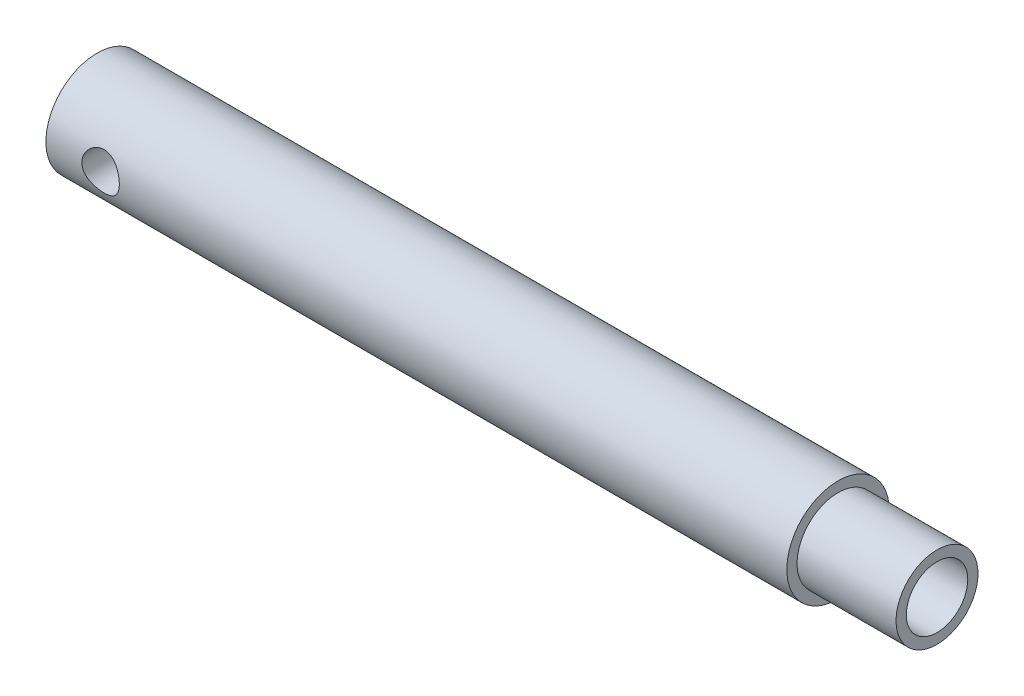
ISO-10303-21;
HEADER;
FILE_DESCRIPTION(('STEP AP214'),'2;1');
FILE_NAME('part.step','',(''),(''),'','','');
FILE_SCHEMA(('AUTOMOTIVE_DESIGN { 1 0 10303 214 1 1 1 1 }'));
ENDSEC;
DATA;
#1=APPLICATION_CONTEXT('core data for automotive mechanical design processes');
#2=APPLICATION_PROTOCOL_DEFINITION('international standard','automotive_design',2000,#1);
#3=PRODUCT_CONTEXT('',#1,'mechanical');
#4=PRODUCT('Part','Part','',(#3));
#5=PRODUCT_RELATED_PRODUCT_CATEGORY('part','',(#4));
#6=PRODUCT_DEFINITION_FORMATION('','',#4);
#7=PRODUCT_DEFINITION_CONTEXT('part definition',#1,'design');
#8=PRODUCT_DEFINITION('design','',#6,#7);
#9=PRODUCT_DEFINITION_SHAPE('','',#8);
#10=(LENGTH_UNIT() NAMED_UNIT(*) SI_UNIT(.MILLI.,.METRE.));
#11=(NAMED_UNIT(*) PLANE_ANGLE_UNIT() SI_UNIT($,.RADIAN.));
#12=(NAMED_UNIT(*) SI_UNIT($,.STERADIAN.) SOLID_ANGLE_UNIT());
#13=UNCERTAINTY_MEASURE_WITH_UNIT(LENGTH_MEASURE(1.E-05),#10,'distance_accuracy_value','');
#14=(GEOMETRIC_REPRESENTATION_CONTEXT(3) GLOBAL_UNCERTAINTY_ASSIGNED_CONTEXT((#13)) GLOBAL_UNIT_ASSIGNED_CONTEXT((#10,
#11,#12)) REPRESENTATION_CONTEXT('',''));
#15=CARTESIAN_POINT('',(0.,0.,0.));
#16=DIRECTION('',(0.,0.,1.));
#17=DIRECTION('',(1.,0.,0.));
#18=AXIS2_PLACEMENT_3D('',#15,#16,#17);
#19=CARTESIAN_POINT('',(123.,0.,0.));
#20=DIRECTION('',(1.,0.,0.));
#21=DIRECTION('',(0.,0.,-1.));
#22=AXIS2_PLACEMENT_3D('',#19,#20,#21);
#23=CYLINDRICAL_SURFACE('',#22,7.5);
#24=CARTESIAN_POINT('',(10.75,0.,7.5));
#25=CARTESIAN_POINT('',(10.7500042398441,0.149163400914619,7.50000312186943));
#26=CARTESIAN_POINT('',(10.7378254857149,0.29829715261848,7.49551083407196));
#27=CARTESIAN_POINT('',(10.6896192360573,0.592120610638628,7.47803771691331));
#28=CARTESIAN_POINT('',(10.6535940020788,0.736810737017477,7.46505769251259));
#29=CARTESIAN_POINT('',(10.5591314540441,1.01746784637522,7.43200599882739));
#30=CARTESIAN_POINT('',(10.5007361961014,1.15345064275875,7.41194764249896));
#31=CARTESIAN_POINT('',(10.3634001973795,1.41368339201445,7.36674725461798));
#32=CARTESIAN_POINT('',(10.2844542125463,1.53793033913379,7.34160392586796));
#33=CARTESIAN_POINT('',(10.1048834128569,1.7762429222357,7.28769120419502));
#34=CARTESIAN_POINT('',(10.0035669930007,1.88976472910907,7.25882233991119));
#35=CARTESIAN_POINT('',(9.78359974595652,2.09863947514447,7.20121334184221));
#36=CARTESIAN_POINT('',(9.66494396335599,2.19398720232952,7.17247324728629));
#37=CARTESIAN_POINT('',(9.40844037144512,2.36719005872891,7.11723192199314));
#38=CARTESIAN_POINT('',(9.27005454324459,2.44428985961203,7.09084889561059));
#39=CARTESIAN_POINT('',(8.9811593733666,2.5738807153727,7.04484932142569));
#40=CARTESIAN_POINT('',(8.83065465758281,2.626381108384,7.02523020673632));
#41=CARTESIAN_POINT('',(8.5280411185994,2.70315787768425,6.99603990329749));
#42=CARTESIAN_POINT('',(8.3762312559657,2.72846856766621,6.98610194555094));
#43=CARTESIAN_POINT('',(8.07021881070405,2.75338169967862,6.97632326042149));
#44=CARTESIAN_POINT('',(7.91601718476962,2.7529941686023,6.97647859485257));
#45=CARTESIAN_POINT('',(7.61892107740938,2.72731524634157,6.98655161563675));
#46=CARTESIAN_POINT('',(7.4758819285807,2.70343999386611,6.99591416236742));
#47=CARTESIAN_POINT('',(7.1960026954969,2.63379801380004,7.02242705549906));
#48=CARTESIAN_POINT('',(7.05916350641865,2.58802813592603,7.03957852258203));
#49=CARTESIAN_POINT('',(6.79261420844082,2.47508832183277,7.08008337610026));
#50=CARTESIAN_POINT('',(6.66308140599621,2.40754043957436,7.10354498086313));
#51=CARTESIAN_POINT('',(6.41677064932366,2.25322516181072,7.15398860670264));
#52=CARTESIAN_POINT('',(6.29999697892969,2.16645134069005,7.18097180350953));
#53=CARTESIAN_POINT('',(6.07465451629212,1.96960155284458,7.23752687525343));
#54=CARTESIAN_POINT('',(5.967089800233,1.85838932735392,7.26715387777086));
#55=CARTESIAN_POINT('',(5.77184624585726,1.61915779399269,7.32416772152515));
#56=CARTESIAN_POINT('',(5.68417020098944,1.49113612914646,7.3515542477326));
#57=CARTESIAN_POINT('',(5.53015007880803,1.21944943250202,7.40150404263883));
#58=CARTESIAN_POINT('',(5.46412666462135,1.07558804380358,7.42399328235867));
#59=CARTESIAN_POINT('',(5.35754756842616,0.777771681936057,7.46106828194135));
#60=CARTESIAN_POINT('',(5.31698109264479,0.623821017253827,7.47565739110895));
#61=CARTESIAN_POINT('',(5.26436589929931,0.318657156904127,7.49470661210037));
#62=CARTESIAN_POINT('',(5.25096416812749,0.167706972782519,7.49964681722227));
#63=CARTESIAN_POINT('',(5.24913699812723,-0.134347967443712,7.50031608885126));
#64=CARTESIAN_POINT('',(5.26070630836306,-0.285452684374519,7.49604709187873));
#65=CARTESIAN_POINT('',(5.30745479202294,-0.577771015399043,7.47909471176213));
#66=CARTESIAN_POINT('',(5.34175932799965,-0.719144462031496,7.46672323625137));
#67=CARTESIAN_POINT('',(5.43186505273531,-0.994039091678319,7.43512235809386));
#68=CARTESIAN_POINT('',(5.4876690384557,-1.12755925041647,7.41589206317618));
#69=CARTESIAN_POINT('',(5.62094608837148,-1.38727106994184,7.3717934654489));
#70=CARTESIAN_POINT('',(5.69899813004904,-1.51313995048619,7.34677844528394));
#71=CARTESIAN_POINT('',(5.87389639178215,-1.75040675458894,7.29389308718916));
#72=CARTESIAN_POINT('',(5.97074932685248,-1.86179948397539,7.26602173076095));
#73=CARTESIAN_POINT('',(6.18682262576501,-2.07340222713799,7.20858443222809));
#74=CARTESIAN_POINT('',(6.30698505976254,-2.17265048905074,7.17901017230758));
#75=CARTESIAN_POINT('',(6.56285499492149,-2.34974917445373,7.12301420495134));
#76=CARTESIAN_POINT('',(6.69856357482792,-2.4275981117719,7.09659271654603));
#77=CARTESIAN_POINT('',(6.98253737153424,-2.55965637109161,7.05004267507774));
#78=CARTESIAN_POINT('',(7.13083460114393,-2.61380312956744,7.02993081583834));
#79=CARTESIAN_POINT('',(7.43537884810097,-2.69602324831299,6.99881623412452));
#80=CARTESIAN_POINT('',(7.59162118348533,-2.72411178082589,6.98780821140261));
#81=CARTESIAN_POINT('',(7.8972513600388,-2.75209516962454,6.97683139543634));
#82=CARTESIAN_POINT('',(8.04646829196544,-2.75362072167425,6.97622414135253));
#83=CARTESIAN_POINT('',(8.34291155021715,-2.73257863119115,6.98449276936025));
#84=CARTESIAN_POINT('',(8.49013804755031,-2.710013071938,6.99336783146823));
#85=CARTESIAN_POINT('',(8.77426908596597,-2.64267697104267,7.01908063198066));
#86=CARTESIAN_POINT('',(8.9113469700752,-2.59854310235921,7.03568945153917));
#87=CARTESIAN_POINT('',(9.1762391529618,-2.48987356543402,7.0748745278557));
#88=CARTESIAN_POINT('',(9.30405115114603,-2.42533285163216,7.09745226019147));
#89=CARTESIAN_POINT('',(9.553826483125,-2.27387853742159,7.14745651289183));
#90=CARTESIAN_POINT('',(9.67516442831964,-2.18599626211841,7.17507087475862));
#91=CARTESIAN_POINT('',(9.90189324448292,-1.99188099952364,7.23136315938062));
#92=CARTESIAN_POINT('',(10.0072791430997,-1.88564231243218,7.26004141030265));
#93=CARTESIAN_POINT('',(10.2045599797036,-1.65137159946744,7.31698041886032));
#94=CARTESIAN_POINT('',(10.2954974036853,-1.52250654028015,7.34514593066589));
#95=CARTESIAN_POINT('',(10.4543773454967,-1.25034215145006,7.39633669940812));
#96=CARTESIAN_POINT('',(10.5223197694751,-1.10704276289835,7.41936193536523));
#97=CARTESIAN_POINT('',(10.6341699766262,-0.806234015924115,7.45811714803401));
#98=CARTESIAN_POINT('',(10.6774402256295,-0.648460466045057,7.4736521370045));
#99=CARTESIAN_POINT('',(10.7353465218756,-0.32711098218088,7.49458959004745));
#100=CARTESIAN_POINT('',(10.7499953515793,-0.163537671643998,7.4999965772887));
#101=CARTESIAN_POINT('',(10.75,0.,7.5));
#102=B_SPLINE_CURVE_WITH_KNOTS('',3,(#24,#25,#26,#27,#28,#29,#30,#31,#32,#33,#34,#35,#36,#37,
#38,#39,#40,#41,#42,#43,#44,#45,#46,#47,#48,#49,#50,#51,#52,#53,#54,#55,#56,#57,#58,#59,#60,#61,
#62,#63,#64,#65,#66,#67,#68,#69,#70,#71,#72,#73,#74,#75,#76,#77,#78,#79,#80,#81,#82,#83,#84,#85,
#86,#87,#88,#89,#90,#91,#92,#93,#94,#95,#96,#97,#98,#99,#100,#101),.UNSPECIFIED.,.T.,.F.,(4,2,2,
2,2,2,2,2,2,2,2,2,2,2,2,2,2,2,2,2,2,2,2,2,2,2,2,2,2,2,2,2,2,2,2,2,2,2,4),(0.,0.446887269349348,
0.89373216292337,1.33974106914939,1.7858638979375,2.24842473965862,2.71111803601497,
3.19050672893151,3.66971329430219,4.12996375453753,4.5900346359978,5.0239670519462,
5.45796192255757,5.89993527296308,6.34205656133036,6.81248619551746,7.28298186270095,
7.76015995462979,8.23713558552159,8.68970480563612,9.14217886831115,9.57818454876607,
10.0142469703521,10.4628962097749,10.9117059866708,11.385386450699,11.8590998032843,
12.3340561236824,12.80873572978,13.254164536792,13.6995548284527,14.13252653843,
14.5656053837986,15.020648736522,15.4758336382825,15.9541458857871,16.4324600854427,
16.9226310274791,17.4125830067758),.UNSPECIFIED.);
#103=CARTESIAN_POINT('',(10.75,0.,7.5));
#104=VERTEX_POINT('',#103);
#105=EDGE_CURVE('E136',#104,#104,#102,.T.);
#106=ORIENTED_EDGE('',*,*,#105,.F.);
#107=EDGE_LOOP('',(#106));
#108=FACE_BOUND('',#107,.T.);
#109=CARTESIAN_POINT('',(5.25,0.,-7.5));
#110=CARTESIAN_POINT('',(5.24999576015586,0.149163400914619,-7.50000312186943));
#111=CARTESIAN_POINT('',(5.26217451428514,0.29829715261848,-7.49551083407196));
#112=CARTESIAN_POINT('',(5.31038076394274,0.592120610638627,-7.47803771691331));
#113=CARTESIAN_POINT('',(5.34640599792119,0.736810737017476,-7.46505769251259));
#114=CARTESIAN_POINT('',(5.44086854595593,1.01746784637522,-7.43200599882739));
#115=CARTESIAN_POINT('',(5.4992638038986,1.15345064275874,-7.41194764249896));
#116=CARTESIAN_POINT('',(5.63659980262049,1.41368339201445,-7.36674725461798));
#117=CARTESIAN_POINT('',(5.71554578745375,1.53793033913379,-7.34160392586796));
#118=CARTESIAN_POINT('',(5.89511658714314,1.7762429222357,-7.28769120419502));
#119=CARTESIAN_POINT('',(5.99643300699934,1.88976472910907,-7.25882233991119));
#120=CARTESIAN_POINT('',(6.21640025404348,2.09863947514447,-7.20121334184221));
#121=CARTESIAN_POINT('',(6.33505603664401,2.19398720232952,-7.17247324728629));
#122=CARTESIAN_POINT('',(6.59155962855488,2.36719005872891,-7.11723192199314));
#123=CARTESIAN_POINT('',(6.72994545675541,2.44428985961203,-7.09084889561059));
#124=CARTESIAN_POINT('',(7.0188406266334,2.5738807153727,-7.04484932142569));
#125=CARTESIAN_POINT('',(7.16934534241719,2.626381108384,-7.02523020673632));
#126=CARTESIAN_POINT('',(7.4719588814006,2.70315787768425,-6.99603990329749));
#127=CARTESIAN_POINT('',(7.6237687440343,2.72846856766621,-6.98610194555094));
#128=CARTESIAN_POINT('',(7.92978118929595,2.75338169967862,-6.97632326042149));
#129=CARTESIAN_POINT('',(8.08398281523038,2.7529941686023,-6.97647859485257));
#130=CARTESIAN_POINT('',(8.38107892259062,2.72731524634157,-6.98655161563675));
#131=CARTESIAN_POINT('',(8.5241180714193,2.70343999386611,-6.99591416236742));
#132=CARTESIAN_POINT('',(8.8039973045031,2.63379801380004,-7.02242705549906));
#133=CARTESIAN_POINT('',(8.94083649358135,2.58802813592603,-7.03957852258203));
#134=CARTESIAN_POINT('',(9.20738579155918,2.47508832183277,-7.08008337610026));
#135=CARTESIAN_POINT('',(9.33691859400379,2.40754043957436,-7.10354498086313));
#136=CARTESIAN_POINT('',(9.58322935067634,2.25322516181072,-7.15398860670264));
#137=CARTESIAN_POINT('',(9.70000302107031,2.16645134069005,-7.18097180350954));
#138=CARTESIAN_POINT('',(9.92534548370788,1.96960155284458,-7.23752687525343));
#139=CARTESIAN_POINT('',(10.032910199767,1.85838932735392,-7.26715387777086));
#140=CARTESIAN_POINT('',(10.2281537541427,1.61915779399269,-7.32416772152515));
#141=CARTESIAN_POINT('',(10.3158297990106,1.49113612914646,-7.3515542477326));
#142=CARTESIAN_POINT('',(10.469849921192,1.21944943250202,-7.40150404263883));
#143=CARTESIAN_POINT('',(10.5358733353786,1.07558804380358,-7.42399328235867));
#144=CARTESIAN_POINT('',(10.6424524315738,0.777771681936057,-7.46106828194135));
#145=CARTESIAN_POINT('',(10.6830189073552,0.623821017253826,-7.47565739110895));
#146=CARTESIAN_POINT('',(10.7356341007007,0.318657156904126,-7.49470661210037));
#147=CARTESIAN_POINT('',(10.7490358318725,0.167706972782518,-7.49964681722227));
#148=CARTESIAN_POINT('',(10.7508630018728,-0.134347967443713,-7.50031608885126));
#149=CARTESIAN_POINT('',(10.7392936916369,-0.28545268437452,-7.49604709187873));
#150=CARTESIAN_POINT('',(10.6925452079771,-0.577771015399044,-7.47909471176213));
#151=CARTESIAN_POINT('',(10.6582406720003,-0.719144462031497,-7.46672323625137));
#152=CARTESIAN_POINT('',(10.5681349472647,-0.99403909167832,-7.43512235809386));
#153=CARTESIAN_POINT('',(10.5123309615443,-1.12755925041647,-7.41589206317618));
#154=CARTESIAN_POINT('',(10.3790539116285,-1.38727106994184,-7.3717934654489));
#155=CARTESIAN_POINT('',(10.301001869951,-1.51313995048619,-7.34677844528394));
#156=CARTESIAN_POINT('',(10.1261036082178,-1.75040675458894,-7.29389308718916));
#157=CARTESIAN_POINT('',(10.0292506731475,-1.86179948397539,-7.26602173076095));
#158=CARTESIAN_POINT('',(9.81317737423499,-2.07340222713799,-7.20858443222809));
#159=CARTESIAN_POINT('',(9.69301494023746,-2.17265048905074,-7.17901017230759));
#160=CARTESIAN_POINT('',(9.43714500507851,-2.34974917445373,-7.12301420495134));
#161=CARTESIAN_POINT('',(9.30143642517208,-2.4275981117719,-7.09659271654603));
#162=CARTESIAN_POINT('',(9.01746262846576,-2.55965637109161,-7.05004267507774));
#163=CARTESIAN_POINT('',(8.86916539885607,-2.61380312956744,-7.02993081583834));
#164=CARTESIAN_POINT('',(8.56462115189903,-2.69602324831299,-6.99881623412452));
#165=CARTESIAN_POINT('',(8.40837881651467,-2.72411178082589,-6.98780821140261));
#166=CARTESIAN_POINT('',(8.1027486399612,-2.75209516962454,-6.97683139543633));
#167=CARTESIAN_POINT('',(7.95353170803456,-2.75362072167425,-6.97622414135252));
#168=CARTESIAN_POINT('',(7.65708844978285,-2.73257863119115,-6.98449276936025));
#169=CARTESIAN_POINT('',(7.50986195244969,-2.710013071938,-6.99336783146823));
#170=CARTESIAN_POINT('',(7.22573091403403,-2.64267697104267,-7.01908063198066));
#171=CARTESIAN_POINT('',(7.0886530299248,-2.59854310235921,-7.03568945153917));
#172=CARTESIAN_POINT('',(6.8237608470382,-2.48987356543402,-7.0748745278557));
#173=CARTESIAN_POINT('',(6.69594884885397,-2.42533285163216,-7.09745226019147));
#174=CARTESIAN_POINT('',(6.446173516875,-2.27387853742159,-7.14745651289183));
#175=CARTESIAN_POINT('',(6.32483557168036,-2.18599626211841,-7.17507087475862));
#176=CARTESIAN_POINT('',(6.09810675551708,-1.99188099952364,-7.23136315938062));
#177=CARTESIAN_POINT('',(5.9927208569003,-1.88564231243218,-7.26004141030265));
#178=CARTESIAN_POINT('',(5.79544002029642,-1.65137159946743,-7.31698041886032));
#179=CARTESIAN_POINT('',(5.70450259631471,-1.52250654028015,-7.34514593066589));
#180=CARTESIAN_POINT('',(5.5456226545033,-1.25034215145006,-7.39633669940812));
#181=CARTESIAN_POINT('',(5.47768023052494,-1.10704276289835,-7.41936193536523));
#182=CARTESIAN_POINT('',(5.3658300233738,-0.806234015924114,-7.45811714803401));
#183=CARTESIAN_POINT('',(5.32255977437051,-0.648460466045057,-7.4736521370045));
#184=CARTESIAN_POINT('',(5.26465347812442,-0.32711098218088,-7.49458959004745));
#185=CARTESIAN_POINT('',(5.2500046484207,-0.163537671643997,-7.4999965772887));
#186=CARTESIAN_POINT('',(5.25,0.,-7.5));
#187=B_SPLINE_CURVE_WITH_KNOTS('',3,(#109,#110,#111,#112,#113,#114,#115,#116,#117,#118,#119,
#120,#121,#122,#123,#124,#125,#126,#127,#128,#129,#130,#131,#132,#133,#134,#135,#136,#137,#138,
#139,#140,#141,#142,#143,#144,#145,#146,#147,#148,#149,#150,#151,#152,#153,#154,#155,#156,#157,
#158,#159,#160,#161,#162,#163,#164,#165,#166,#167,#168,#169,#170,#171,#172,#173,#174,#175,#176,
#177,#178,#179,#180,#181,#182,#183,#184,#185,#186),.UNSPECIFIED.,.T.,.F.,(4,2,2,2,2,2,2,2,2,2,2,
2,2,2,2,2,2,2,2,2,2,2,2,2,2,2,2,2,2,2,2,2,2,2,2,2,2,2,4),(0.,0.446887269349348,
0.893732162923369,1.33974106914939,1.7858638979375,2.24842473965861,2.71111803601497,
3.1905067289315,3.66971329430219,4.12996375453753,4.5900346359978,5.0239670519462,
5.45796192255757,5.89993527296308,6.34205656133036,6.81248619551746,7.28298186270094,
7.76015995462979,8.23713558552158,8.68970480563611,9.14217886831115,9.57818454876606,
10.0142469703521,10.4628962097749,10.9117059866708,11.385386450699,11.8590998032843,
12.3340561236824,12.80873572978,13.254164536792,13.6995548284527,14.13252653843,
14.5656053837986,15.020648736522,15.4758336382825,15.9541458857871,16.4324600854427,
16.9226310274791,17.4125830067758),.UNSPECIFIED.);
#188=CARTESIAN_POINT('',(5.25,0.,-7.5));
#189=VERTEX_POINT('',#188);
#190=EDGE_CURVE('E70',#189,#189,#187,.T.);
#191=ORIENTED_EDGE('',*,*,#190,.F.);
#192=EDGE_LOOP('',(#191));
#193=FACE_BOUND('',#192,.T.);
#194=CARTESIAN_POINT('',(0.,0.,0.));
#195=DIRECTION('',(1.,0.,0.));
#196=DIRECTION('',(0.,0.,-1.));
#197=AXIS2_PLACEMENT_3D('',#194,#195,#196);
#198=CIRCLE('',#197,7.5);
#199=CARTESIAN_POINT('',(0.,0.,-7.5));
#200=VERTEX_POINT('',#199);
#201=EDGE_CURVE('E67',#200,#200,#198,.T.);
#202=ORIENTED_EDGE('',*,*,#201,.T.);
#203=EDGE_LOOP('',(#202));
#204=FACE_BOUND('',#203,.T.);
#205=CARTESIAN_POINT('',(108.5,0.,0.));
#206=DIRECTION('',(1.,0.,0.));
#207=DIRECTION('',(0.,0.,-1.));
#208=AXIS2_PLACEMENT_3D('',#205,#206,#207);
#209=CIRCLE('',#208,7.5);
#210=CARTESIAN_POINT('',(108.5,0.,-7.5));
#211=VERTEX_POINT('',#210);
#212=EDGE_CURVE('E10',#211,#211,#209,.T.);
#213=ORIENTED_EDGE('',*,*,#212,.F.);
#214=EDGE_LOOP('',(#213));
#215=FACE_BOUND('',#214,.T.);
#216=ADVANCED_FACE('F32',(#108,#193,#204,#215),#23,.T.);
#217=CARTESIAN_POINT('',(108.5,7.5,0.));
#218=DIRECTION('',(1.,0.,0.));
#219=DIRECTION('',(0.,0.,-1.));
#220=AXIS2_PLACEMENT_3D('',#217,#218,#219);
#221=PLANE('',#220);
#222=ORIENTED_EDGE('',*,*,#212,.T.);
#223=EDGE_LOOP('',(#222));
#224=FACE_BOUND('',#223,.T.);
#225=CARTESIAN_POINT('',(108.5,0.,0.));
#226=DIRECTION('',(1.,0.,0.));
#227=DIRECTION('',(0.,0.,-1.));
#228=AXIS2_PLACEMENT_3D('',#225,#226,#227);
#229=CIRCLE('',#228,6.);
#230=CARTESIAN_POINT('',(108.5,0.,-6.));
#231=VERTEX_POINT('',#230);
#232=EDGE_CURVE('E39',#231,#231,#229,.T.);
#233=ORIENTED_EDGE('',*,*,#232,.F.);
#234=EDGE_LOOP('',(#233));
#235=FACE_BOUND('',#234,.T.);
#236=ADVANCED_FACE('F124',(#224,#235),#221,.T.);
#237=CARTESIAN_POINT('',(123.,0.,0.));
#238=DIRECTION('',(1.,0.,0.));
#239=DIRECTION('',(0.,0.,-1.));
#240=AXIS2_PLACEMENT_3D('',#237,#238,#239);
#241=CYLINDRICAL_SURFACE('',#240,6.);
#242=ORIENTED_EDGE('',*,*,#232,.T.);
#243=EDGE_LOOP('',(#242));
#244=FACE_BOUND('',#243,.T.);
#245=CARTESIAN_POINT('',(123.,0.,0.));
#246=DIRECTION('',(1.,0.,0.));
#247=DIRECTION('',(0.,0.,-1.));
#248=AXIS2_PLACEMENT_3D('',#245,#246,#247);
#249=CIRCLE('',#248,6.);
#250=CARTESIAN_POINT('',(123.,0.,-6.));
#251=VERTEX_POINT('',#250);
#252=EDGE_CURVE('E43',#251,#251,#249,.T.);
#253=ORIENTED_EDGE('',*,*,#252,.F.);
#254=EDGE_LOOP('',(#253));
#255=FACE_BOUND('',#254,.T.);
#256=ADVANCED_FACE('F121',(#244,#255),#241,.T.);
#257=CARTESIAN_POINT('',(123.,6.,0.));
#258=DIRECTION('',(1.,0.,0.));
#259=DIRECTION('',(0.,0.,-1.));
#260=AXIS2_PLACEMENT_3D('',#257,#258,#259);
#261=PLANE('',#260);
#262=ORIENTED_EDGE('',*,*,#252,.T.);
#263=EDGE_LOOP('',(#262));
#264=FACE_BOUND('',#263,.T.);
#265=CARTESIAN_POINT('',(123.,0.,0.));
#266=DIRECTION('',(1.,0.,0.));
#267=DIRECTION('',(0.,0.,-1.));
#268=AXIS2_PLACEMENT_3D('',#265,#266,#267);
#269=CIRCLE('',#268,4.5);
#270=CARTESIAN_POINT('',(123.,0.,-4.5));
#271=VERTEX_POINT('',#270);
#272=EDGE_CURVE('E47',#271,#271,#269,.T.);
#273=ORIENTED_EDGE('',*,*,#272,.F.);
#274=EDGE_LOOP('',(#273));
#275=FACE_BOUND('',#274,.T.);
#276=ADVANCED_FACE('F117',(#264,#275),#261,.T.);
#277=CARTESIAN_POINT('',(123.,0.,0.));
#278=DIRECTION('',(1.,0.,0.));
#279=DIRECTION('',(0.,0.,-1.));
#280=AXIS2_PLACEMENT_3D('',#277,#278,#279);
#281=CYLINDRICAL_SURFACE('',#280,4.5);
#282=ORIENTED_EDGE('',*,*,#272,.T.);
#283=EDGE_LOOP('',(#282));
#284=FACE_BOUND('',#283,.T.);
#285=CARTESIAN_POINT('',(100.,0.,0.));
#286=DIRECTION('',(1.,0.,0.));
#287=DIRECTION('',(0.,0.,-1.));
#288=AXIS2_PLACEMENT_3D('',#285,#286,#287);
#289=CIRCLE('',#288,4.5);
#290=CARTESIAN_POINT('',(100.,0.,-4.5));
#291=VERTEX_POINT('',#290);
#292=EDGE_CURVE('E52',#291,#291,#289,.T.);
#293=ORIENTED_EDGE('',*,*,#292,.F.);
#294=EDGE_LOOP('',(#293));
#295=FACE_BOUND('',#294,.T.);
#296=ADVANCED_FACE('F113',(#284,#295),#281,.F.);
#297=CARTESIAN_POINT('',(100.,4.,0.));
#298=DIRECTION('',(1.,0.,0.));
#299=DIRECTION('',(0.,0.,-1.));
#300=AXIS2_PLACEMENT_3D('',#297,#298,#299);
#301=PLANE('',#300);
#302=ORIENTED_EDGE('',*,*,#292,.T.);
#303=EDGE_LOOP('',(#302));
#304=FACE_BOUND('',#303,.T.);
#305=CARTESIAN_POINT('',(100.,0.,0.));
#306=DIRECTION('',(1.,0.,0.));
#307=DIRECTION('',(0.,0.,-1.));
#308=AXIS2_PLACEMENT_3D('',#305,#306,#307);
#309=CIRCLE('',#308,4.);
#310=CARTESIAN_POINT('',(100.,0.,-4.));
#311=VERTEX_POINT('',#310);
#312=EDGE_CURVE('E55',#311,#311,#309,.T.);
#313=ORIENTED_EDGE('',*,*,#312,.F.);
#314=EDGE_LOOP('',(#313));
#315=FACE_BOUND('',#314,.T.);
#316=ADVANCED_FACE('F109',(#304,#315),#301,.T.);
#317=CARTESIAN_POINT('',(123.,0.,0.));
#318=DIRECTION('',(1.,0.,0.));
#319=DIRECTION('',(0.,0.,-1.));
#320=AXIS2_PLACEMENT_3D('',#317,#318,#319);
#321=CYLINDRICAL_SURFACE('',#320,3.99999999999999);
#322=ORIENTED_EDGE('',*,*,#312,.T.);
#323=EDGE_LOOP('',(#322));
#324=FACE_BOUND('',#323,.T.);
#325=CARTESIAN_POINT('',(11.,0.,0.));
#326=DIRECTION('',(1.,0.,0.));
#327=DIRECTION('',(0.,0.,-1.));
#328=AXIS2_PLACEMENT_3D('',#325,#326,#327);
#329=CIRCLE('',#328,3.99999999999999);
#330=CARTESIAN_POINT('',(11.,0.,-3.99999999999999));
#331=VERTEX_POINT('',#330);
#332=EDGE_CURVE('E58',#331,#331,#329,.T.);
#333=ORIENTED_EDGE('',*,*,#332,.F.);
#334=EDGE_LOOP('',(#333));
#335=FACE_BOUND('',#334,.T.);
#336=ADVANCED_FACE('F105',(#324,#335),#321,.F.);
#337=CARTESIAN_POINT('',(11.,3.99999999999999,0.));
#338=DIRECTION('',(1.,0.,0.));
#339=DIRECTION('',(0.,0.,-1.));
#340=AXIS2_PLACEMENT_3D('',#337,#338,#339);
#341=PLANE('',#340);
#342=ORIENTED_EDGE('',*,*,#332,.T.);
#343=EDGE_LOOP('',(#342));
#344=FACE_BOUND('',#343,.T.);
#345=CARTESIAN_POINT('',(11.,0.,0.));
#346=DIRECTION('',(1.,0.,0.));
#347=DIRECTION('',(0.,0.,-1.));
#348=AXIS2_PLACEMENT_3D('',#345,#346,#347);
#349=CIRCLE('',#348,3.5);
#350=CARTESIAN_POINT('',(11.,0.,-3.5));
#351=VERTEX_POINT('',#350);
#352=EDGE_CURVE('E61',#351,#351,#349,.T.);
#353=ORIENTED_EDGE('',*,*,#352,.F.);
#354=EDGE_LOOP('',(#353));
#355=FACE_BOUND('',#354,.T.);
#356=ADVANCED_FACE('F101',(#344,#355),#341,.T.);
#357=CARTESIAN_POINT('',(123.,0.,0.));
#358=DIRECTION('',(1.,0.,0.));
#359=DIRECTION('',(0.,0.,-1.));
#360=AXIS2_PLACEMENT_3D('',#357,#358,#359);
#361=CYLINDRICAL_SURFACE('',#360,3.5);
#362=CARTESIAN_POINT('',(10.75,0.,3.5));
#363=CARTESIAN_POINT('',(10.7499995355662,-0.0663689307559184,3.49999955674576));
#364=CARTESIAN_POINT('',(10.7475914860623,-0.132745851858584,3.49810639539016));
#365=CARTESIAN_POINT('',(10.7380111247323,-0.264952535682278,3.49058704511513));
#366=CARTESIAN_POINT('',(10.7308364457554,-0.330782010081833,3.48495900142128));
#367=CARTESIAN_POINT('',(10.7022858605157,-0.526828755623839,3.46261392789626));
#368=CARTESIAN_POINT('',(10.6738836584641,-0.655497673920044,3.44043623430095));
#369=CARTESIAN_POINT('',(10.6003965560697,-0.903979204255256,3.38364111689331));
#370=CARTESIAN_POINT('',(10.5554158614788,-1.02384164344569,3.34910143400016));
#371=CARTESIAN_POINT('',(10.4509724612366,-1.25345411311455,3.27010728298878));
#372=CARTESIAN_POINT('',(10.3915092483714,-1.36320378923318,3.22565246762246));
#373=CARTESIAN_POINT('',(10.2378476409064,-1.60678109688964,3.11317241900944));
#374=CARTESIAN_POINT('',(10.1387082275262,-1.73615288293255,3.04226635425376));
#375=CARTESIAN_POINT('',(9.92150362845824,-1.97392531209018,2.89366827121686));
#376=CARTESIAN_POINT('',(9.80338447736297,-2.08226415215584,2.81595719971648));
#377=CARTESIAN_POINT('',(9.61263214133305,-2.22900537779148,2.69917398223201));
#378=CARTESIAN_POINT('',(9.54623944315643,-2.27557746649745,2.65991707813009));
#379=CARTESIAN_POINT('',(9.4090578300489,-2.36298028675325,2.58258060610051));
#380=CARTESIAN_POINT('',(9.33826759893434,-2.40380928734208,2.54450139581487));
#381=CARTESIAN_POINT('',(9.19249623805877,-2.47934895939843,2.47095128139155));
#382=CARTESIAN_POINT('',(9.11752768826433,-2.51407681447756,2.43547322119007));
#383=CARTESIAN_POINT('',(8.96323986268085,-2.57713192252029,2.36864934193178));
#384=CARTESIAN_POINT('',(8.8839243034485,-2.60546454030521,2.3373000685938));
#385=CARTESIAN_POINT('',(8.70676734558343,-2.65950617243312,2.27573876931547));
#386=CARTESIAN_POINT('',(8.60810404019919,-2.68390056317434,2.24667406216111));
#387=CARTESIAN_POINT('',(8.40608611217337,-2.72178334536306,2.20063763936689));
#388=CARTESIAN_POINT('',(8.30274326535531,-2.73529766280693,2.18363718749645));
#389=CARTESIAN_POINT('',(8.09294506557598,-2.75045032098895,2.16453132459079));
#390=CARTESIAN_POINT('',(7.98647219103793,-2.75199890269644,2.16253849361484));
#391=CARTESIAN_POINT('',(7.77487917890306,-2.74282110231918,2.17415991412245));
#392=CARTESIAN_POINT('',(7.66976055002671,-2.7320820562901,2.18779026728571));
#393=CARTESIAN_POINT('',(7.44558032156373,-2.6963370852446,2.23174355084619));
#394=CARTESIAN_POINT('',(7.32739663363985,-2.66911901922295,2.26462050993599));
#395=CARTESIAN_POINT('',(7.09915276928609,-2.60100940682524,2.34252027429973));
#396=CARTESIAN_POINT('',(6.98911666928968,-2.56007916669685,2.38757737990306));
#397=CARTESIAN_POINT('',(6.80687214019678,-2.4791032347045,2.47112354838104));
#398=CARTESIAN_POINT('',(6.73259892371694,-2.44192518355214,2.50799828509981));
#399=CARTESIAN_POINT('',(6.58846492178904,-2.36154242687047,2.58382839291191));
#400=CARTESIAN_POINT('',(6.51860598100062,-2.31833522573235,2.62278462144265));
#401=CARTESIAN_POINT('',(6.38327096781638,-2.22607161751133,2.70153378026052));
#402=CARTESIAN_POINT('',(6.31779817194299,-2.17701091219506,2.74132730749665));
#403=CARTESIAN_POINT('',(6.19137883218026,-2.0731837682114,2.82067280009189));
#404=CARTESIAN_POINT('',(6.13043461047417,-2.0184144363639,2.86022463210284));
#405=CARTESIAN_POINT('',(5.9524178562193,-1.84334641307315,2.97860475868731));
#406=CARTESIAN_POINT('',(5.84265722978362,-1.7139769545765,3.05564244130566));
#407=CARTESIAN_POINT('',(5.69570543787574,-1.50334336718463,3.16167059943222));
#408=CARTESIAN_POINT('',(5.64969473090955,-1.43042358498029,3.19540574897198));
#409=CARTESIAN_POINT('',(5.56411591617629,-1.27926117148676,3.25886481619874));
#410=CARTESIAN_POINT('',(5.52454497698252,-1.2010209010728,3.28859049577355));
#411=CARTESIAN_POINT('',(5.43771458936684,-1.00634893201562,3.35435560570936));
#412=CARTESIAN_POINT('',(5.39399851762182,-0.887456974965994,3.38795484078338));
#413=CARTESIAN_POINT('',(5.32299421718798,-0.642194706084435,3.44286983605808));
#414=CARTESIAN_POINT('',(5.29569346535439,-0.515830176077432,3.46419495956923));
#415=CARTESIAN_POINT('',(5.25906399549766,-0.258336383600444,3.49286377870533));
#416=CARTESIAN_POINT('',(5.24981437392016,-0.127188704924076,3.50014593922883));
#417=CARTESIAN_POINT('',(5.25019126192394,0.13506236832487,3.49984963261285));
#418=CARTESIAN_POINT('',(5.25981693328815,0.266165764605357,3.49227182537723));
#419=CARTESIAN_POINT('',(5.29598112951634,0.515332140161936,3.46397237983086));
#420=CARTESIAN_POINT('',(5.32133490757141,0.633678193687234,3.44417191039282));
#421=CARTESIAN_POINT('',(5.38646975673135,0.863875990606316,3.39376136448812));
#422=CARTESIAN_POINT('',(5.42625428913188,0.975726168455452,3.36314869470215));
#423=CARTESIAN_POINT('',(5.52206947955311,1.19927940129709,3.29037871453038));
#424=CARTESIAN_POINT('',(5.57911135522724,1.31031455411094,3.24751656956845));
#425=CARTESIAN_POINT('',(5.70584467191242,1.52135639305891,3.15417380619629));
#426=CARTESIAN_POINT('',(5.77554186254912,1.62135803305664,3.1036897267149));
#427=CARTESIAN_POINT('',(5.94053536022687,1.82807075152817,2.98744135758463));
#428=CARTESIAN_POINT('',(6.03817431534979,1.93230977909346,2.9206140746065));
#429=CARTESIAN_POINT('',(6.24741986407933,2.12394335506473,2.78436712815443));
#430=CARTESIAN_POINT('',(6.35904573115613,2.21131422931744,2.71494398211293));
#431=CARTESIAN_POINT('',(6.59232543940023,2.36644459441577,2.58072719446381));
#432=CARTESIAN_POINT('',(6.71362369695512,2.43467309350051,2.51585897979468));
#433=CARTESIAN_POINT('',(6.96893726853402,2.55326000476044,2.39540598250408));
#434=CARTESIAN_POINT('',(7.10292511865583,2.60365593983523,2.33980183875234));
#435=CARTESIAN_POINT('',(7.33900808288004,2.67124246216731,2.26191391260786));
#436=CARTESIAN_POINT('',(7.43785879842548,2.69389207681612,2.23465139676664));
#437=CARTESIAN_POINT('',(7.63994360439244,2.72824327520216,2.19258794043651));
#438=CARTESIAN_POINT('',(7.74316733030621,2.73996938067557,2.17775909563087));
#439=CARTESIAN_POINT('',(7.95206463945738,2.75158018375908,2.16307995222684));
#440=CARTESIAN_POINT('',(8.05774958449212,2.75138955747548,2.16332493289021));
#441=CARTESIAN_POINT('',(8.2673162543463,2.73899588244782,2.17898639546662));
#442=CARTESIAN_POINT('',(8.3711955761027,2.72677791202377,2.19442172322103));
#443=CARTESIAN_POINT('',(8.59628606489426,2.6875075689477,2.24241724298109));
#444=CARTESIAN_POINT('',(8.71637048476667,2.65781277452483,2.27796526181279));
#445=CARTESIAN_POINT('',(8.94789930824248,2.58434388865647,2.36097786847793));
#446=CARTESIAN_POINT('',(9.05931801562995,2.54052976805334,2.40847625135938));
#447=CARTESIAN_POINT('',(9.2427858309467,2.45461254712709,2.49549625806364));
#448=CARTESIAN_POINT('',(9.31704415745787,2.41554298398386,2.53346405838472));
#449=CARTESIAN_POINT('',(9.46103664190358,2.33127353626131,2.61121600224405));
#450=CARTESIAN_POINT('',(9.53076901025998,2.28607124835248,2.65100085378427));
#451=CARTESIAN_POINT('',(9.66571270027513,2.18969736387711,2.73114512424909));
#452=CARTESIAN_POINT('',(9.73092118822784,2.13852207877146,2.77150488455124));
#453=CARTESIAN_POINT('',(9.85664568187268,2.03033435488217,2.85171803965753));
#454=CARTESIAN_POINT('',(9.91715927092472,1.97331894454349,2.89157116496826));
#455=CARTESIAN_POINT('',(10.0929636686656,1.79181392145389,3.01004657051436));
#456=CARTESIAN_POINT('',(10.2007152043066,1.65814272100985,3.08646909531278));
#457=CARTESIAN_POINT('',(10.3438522416459,1.44096025937674,3.19062818689932));
#458=CARTESIAN_POINT('',(10.3884630492128,1.36583358393018,3.22358656266395));
#459=CARTESIAN_POINT('',(10.4709212939461,1.21028438942092,3.28514727753858));
#460=CARTESIAN_POINT('',(10.508772484706,1.12986484364069,3.31375203288795));
#461=CARTESIAN_POINT('',(10.589834473795,0.932982596255156,3.37547228620095));
#462=CARTESIAN_POINT('',(10.6296907431842,0.814356641745718,3.40622619121016));
#463=CARTESIAN_POINT('',(10.6930907241982,0.570561333235451,3.45540645558367));
#464=CARTESIAN_POINT('',(10.7166757471346,0.445409424489613,3.47386403015681));
#465=CARTESIAN_POINT('',(10.7376243349033,0.265993880308745,3.49028324624073));
#466=CARTESIAN_POINT('',(10.7422579729164,0.212983557365913,3.49391989113823));
#467=CARTESIAN_POINT('',(10.7484463543864,0.106650589565196,3.4987787302368));
#468=CARTESIAN_POINT('',(10.7500003731756,0.0533278741578678,3.5000003561577));
#469=CARTESIAN_POINT('',(10.75,0.,3.5));
#470=B_SPLINE_CURVE_WITH_KNOTS('',3,(#362,#363,#364,#365,#366,#367,#368,#369,#370,#371,#372,
#373,#374,#375,#376,#377,#378,#379,#380,#381,#382,#383,#384,#385,#386,#387,#388,#389,#390,#391,
#392,#393,#394,#395,#396,#397,#398,#399,#400,#401,#402,#403,#404,#405,#406,#407,#408,#409,#410,
#411,#412,#413,#414,#415,#416,#417,#418,#419,#420,#421,#422,#423,#424,#425,#426,#427,#428,#429,
#430,#431,#432,#433,#434,#435,#436,#437,#438,#439,#440,#441,#442,#443,#444,#445,#446,#447,#448,
#449,#450,#451,#452,#453,#454,#455,#456,#457,#458,#459,#460,#461,#462,#463,#464,#465,#466,#467,
#468,#469),.UNSPECIFIED.,.T.,.F.,(4,2,2,2,2,2,2,2,2,2,2,2,2,2,2,2,2,2,2,2,2,2,2,2,2,2,2,2,2,2,2,
2,2,2,2,2,2,2,2,2,2,2,2,2,2,2,2,2,2,2,2,2,2,4),(0.,0.199043272259862,0.398185465150315,
0.796785152029354,1.19292097971004,1.58907068305215,2.1195602224851,2.65158570796779,
2.92165031863625,3.19179615289203,3.46116849070694,3.73031401127351,4.04629771396656,
4.36152621557355,4.67911707863228,4.99703555403529,5.37193647675608,5.74790435324466,
6.02021124483992,6.29263118695108,6.56525241286236,6.83801248359776,7.39354491281026,
7.67093795320638,7.94820869842601,8.33964945909514,8.73079121190766,9.12364305529548,
9.51647745325012,9.88281122740592,10.249232926895,10.6437298409354,11.0384064352836,
11.5097734042398,11.9817971943423,12.4409749770508,12.8991807403451,13.2130895082396,
13.5262918850204,13.841474166518,14.1570479711964,14.5410578785996,14.9261661995472,
15.2021434050526,15.4782290762703,15.7544861514136,16.0308844957586,16.5910247771717,
16.8707815939512,17.1503825763228,17.5353370112185,17.919310446643,18.0792054098282,
18.239137993556),.UNSPECIFIED.);
#471=CARTESIAN_POINT('',(10.75,0.,3.5));
#472=VERTEX_POINT('',#471);
#473=EDGE_CURVE('E146',#472,#472,#470,.T.);
#474=ORIENTED_EDGE('',*,*,#473,.F.);
#475=EDGE_LOOP('',(#474));
#476=FACE_BOUND('',#475,.T.);
#477=CARTESIAN_POINT('',(5.25000000000001,0.,-3.5));
#478=CARTESIAN_POINT('',(5.25000046443379,-0.0663689307559186,-3.49999955674576));
#479=CARTESIAN_POINT('',(5.25240851393772,-0.132745851858584,-3.49810639539016));
#480=CARTESIAN_POINT('',(5.26198887526769,-0.264952535682279,-3.49058704511513));
#481=CARTESIAN_POINT('',(5.26916355424457,-0.330782010081834,-3.48495900142128));
#482=CARTESIAN_POINT('',(5.29771413948432,-0.526828755623839,-3.46261392789626));
#483=CARTESIAN_POINT('',(5.32611634153588,-0.655497673920044,-3.44043623430095));
#484=CARTESIAN_POINT('',(5.39960344393031,-0.903979204255255,-3.38364111689331));
#485=CARTESIAN_POINT('',(5.44458413852121,-1.02384164344568,-3.34910143400016));
#486=CARTESIAN_POINT('',(5.54902753876337,-1.25345411311455,-3.27010728298878));
#487=CARTESIAN_POINT('',(5.6084907516286,-1.36320378923318,-3.22565246762246));
#488=CARTESIAN_POINT('',(5.76215235909361,-1.60678109688964,-3.11317241900944));
#489=CARTESIAN_POINT('',(5.86129177247378,-1.73615288293255,-3.04226635425376));
#490=CARTESIAN_POINT('',(6.07849637154176,-1.97392531209018,-2.89366827121686));
#491=CARTESIAN_POINT('',(6.19661552263703,-2.08226415215584,-2.81595719971648));
#492=CARTESIAN_POINT('',(6.38736785866695,-2.22900537779148,-2.69917398223201));
#493=CARTESIAN_POINT('',(6.45376055684357,-2.27557746649745,-2.65991707813009));
#494=CARTESIAN_POINT('',(6.5909421699511,-2.36298028675325,-2.58258060610051));
#495=CARTESIAN_POINT('',(6.66173240106566,-2.40380928734208,-2.54450139581487));
#496=CARTESIAN_POINT('',(6.80750376194123,-2.47934895939843,-2.47095128139155));
#497=CARTESIAN_POINT('',(6.88247231173567,-2.51407681447756,-2.43547322119007));
#498=CARTESIAN_POINT('',(7.03676013731915,-2.57713192252029,-2.36864934193178));
#499=CARTESIAN_POINT('',(7.1160756965515,-2.60546454030521,-2.3373000685938));
#500=CARTESIAN_POINT('',(7.29323265441658,-2.65950617243312,-2.27573876931547));
#501=CARTESIAN_POINT('',(7.39189595980082,-2.68390056317434,-2.24667406216111));
#502=CARTESIAN_POINT('',(7.59391388782663,-2.72178334536306,-2.20063763936689));
#503=CARTESIAN_POINT('',(7.69725673464469,-2.73529766280693,-2.18363718749645));
#504=CARTESIAN_POINT('',(7.90705493442402,-2.75045032098895,-2.16453132459079));
#505=CARTESIAN_POINT('',(8.01352780896208,-2.75199890269644,-2.16253849361484));
#506=CARTESIAN_POINT('',(8.22512082109694,-2.74282110231918,-2.17415991412245));
#507=CARTESIAN_POINT('',(8.33023944997329,-2.7320820562901,-2.18779026728571));
#508=CARTESIAN_POINT('',(8.55441967843627,-2.6963370852446,-2.23174355084619));
#509=CARTESIAN_POINT('',(8.67260336636015,-2.66911901922295,-2.264620509936));
#510=CARTESIAN_POINT('',(8.90084723071391,-2.60100940682524,-2.34252027429973));
#511=CARTESIAN_POINT('',(9.01088333071032,-2.56007916669685,-2.38757737990306));
#512=CARTESIAN_POINT('',(9.19312785980322,-2.4791032347045,-2.47112354838104));
#513=CARTESIAN_POINT('',(9.26740107628306,-2.44192518355214,-2.50799828509981));
#514=CARTESIAN_POINT('',(9.41153507821096,-2.36154242687047,-2.58382839291192));
#515=CARTESIAN_POINT('',(9.48139401899938,-2.31833522573235,-2.62278462144265));
#516=CARTESIAN_POINT('',(9.61672903218362,-2.22607161751133,-2.70153378026052));
#517=CARTESIAN_POINT('',(9.68220182805701,-2.17701091219506,-2.74132730749665));
#518=CARTESIAN_POINT('',(9.80862116781974,-2.0731837682114,-2.82067280009189));
#519=CARTESIAN_POINT('',(9.86956538952583,-2.0184144363639,-2.86022463210284));
#520=CARTESIAN_POINT('',(10.0475821437807,-1.84334641307316,-2.97860475868731));
#521=CARTESIAN_POINT('',(10.1573427702164,-1.7139769545765,-3.05564244130566));
#522=CARTESIAN_POINT('',(10.3042945621243,-1.50334336718463,-3.16167059943222));
#523=CARTESIAN_POINT('',(10.3503052690904,-1.43042358498029,-3.19540574897198));
#524=CARTESIAN_POINT('',(10.4358840838237,-1.27926117148676,-3.25886481619874));
#525=CARTESIAN_POINT('',(10.4754550230175,-1.2010209010728,-3.28859049577355));
#526=CARTESIAN_POINT('',(10.5622854106332,-1.00634893201563,-3.35435560570936));
#527=CARTESIAN_POINT('',(10.6060014823782,-0.887456974965996,-3.38795484078338));
#528=CARTESIAN_POINT('',(10.677005782812,-0.642194706084436,-3.44286983605808));
#529=CARTESIAN_POINT('',(10.7043065346456,-0.515830176077434,-3.46419495956923));
#530=CARTESIAN_POINT('',(10.7409360045023,-0.258336383600446,-3.49286377870533));
#531=CARTESIAN_POINT('',(10.7501856260798,-0.127188704924077,-3.50014593922883));
#532=CARTESIAN_POINT('',(10.7498087380761,0.135062368324869,-3.49984963261285));
#533=CARTESIAN_POINT('',(10.7401830667119,0.266165764605355,-3.49227182537723));
#534=CARTESIAN_POINT('',(10.7040188704837,0.515332140161935,-3.46397237983086));
#535=CARTESIAN_POINT('',(10.6786650924286,0.633678193687233,-3.44417191039282));
#536=CARTESIAN_POINT('',(10.6135302432686,0.863875990606315,-3.39376136448812));
#537=CARTESIAN_POINT('',(10.5737457108681,0.975726168455451,-3.36314869470215));
#538=CARTESIAN_POINT('',(10.4779305204469,1.19927940129709,-3.29037871453038));
#539=CARTESIAN_POINT('',(10.4208886447728,1.31031455411094,-3.24751656956845));
#540=CARTESIAN_POINT('',(10.2941553280876,1.52135639305891,-3.15417380619629));
#541=CARTESIAN_POINT('',(10.2244581374509,1.62135803305664,-3.1036897267149));
#542=CARTESIAN_POINT('',(10.0594646397731,1.82807075152817,-2.98744135758463));
#543=CARTESIAN_POINT('',(9.96182568465021,1.93230977909346,-2.92061407460651));
#544=CARTESIAN_POINT('',(9.75258013592067,2.12394335506472,-2.78436712815443));
#545=CARTESIAN_POINT('',(9.64095426884387,2.21131422931744,-2.71494398211293));
#546=CARTESIAN_POINT('',(9.40767456059978,2.36644459441577,-2.58072719446381));
#547=CARTESIAN_POINT('',(9.28637630304488,2.43467309350051,-2.51585897979468));
#548=CARTESIAN_POINT('',(9.03106273146599,2.55326000476043,-2.39540598250408));
#549=CARTESIAN_POINT('',(8.89707488134417,2.60365593983522,-2.33980183875234));
#550=CARTESIAN_POINT('',(8.66099191711996,2.67124246216731,-2.26191391260786));
#551=CARTESIAN_POINT('',(8.56214120157452,2.69389207681612,-2.23465139676664));
#552=CARTESIAN_POINT('',(8.36005639560756,2.72824327520216,-2.19258794043651));
#553=CARTESIAN_POINT('',(8.25683266969379,2.73996938067557,-2.17775909563087));
#554=CARTESIAN_POINT('',(8.04793536054262,2.75158018375908,-2.16307995222684));
#555=CARTESIAN_POINT('',(7.94225041550788,2.75138955747548,-2.16332493289021));
#556=CARTESIAN_POINT('',(7.7326837456537,2.73899588244782,-2.17898639546662));
#557=CARTESIAN_POINT('',(7.6288044238973,2.72677791202377,-2.19442172322104));
#558=CARTESIAN_POINT('',(7.40371393510574,2.6875075689477,-2.24241724298109));
#559=CARTESIAN_POINT('',(7.28362951523334,2.65781277452483,-2.27796526181279));
#560=CARTESIAN_POINT('',(7.05210069175752,2.58434388865647,-2.36097786847793));
#561=CARTESIAN_POINT('',(6.94068198437006,2.54052976805334,-2.40847625135938));
#562=CARTESIAN_POINT('',(6.7572141690533,2.45461254712709,-2.49549625806364));
#563=CARTESIAN_POINT('',(6.68295584254213,2.41554298398386,-2.53346405838472));
#564=CARTESIAN_POINT('',(6.53896335809643,2.33127353626131,-2.61121600224405));
#565=CARTESIAN_POINT('',(6.46923098974002,2.28607124835248,-2.65100085378427));
#566=CARTESIAN_POINT('',(6.33428729972487,2.18969736387711,-2.73114512424909));
#567=CARTESIAN_POINT('',(6.26907881177216,2.13852207877146,-2.77150488455124));
#568=CARTESIAN_POINT('',(6.14335431812732,2.03033435488217,-2.85171803965753));
#569=CARTESIAN_POINT('',(6.08284072907529,1.9733189445435,-2.89157116496825));
#570=CARTESIAN_POINT('',(5.90703633133444,1.79181392145389,-3.01004657051436));
#571=CARTESIAN_POINT('',(5.79928479569342,1.65814272100985,-3.08646909531277));
#572=CARTESIAN_POINT('',(5.65614775835407,1.44096025937674,-3.19062818689932));
#573=CARTESIAN_POINT('',(5.6115369507872,1.36583358393018,-3.22358656266395));
#574=CARTESIAN_POINT('',(5.52907870605389,1.21028438942092,-3.28514727753858));
#575=CARTESIAN_POINT('',(5.49122751529395,1.1298648436407,-3.31375203288795));
#576=CARTESIAN_POINT('',(5.41016552620496,0.932982596255161,-3.37547228620095));
#577=CARTESIAN_POINT('',(5.37030925681584,0.814356641745723,-3.40622619121016));
#578=CARTESIAN_POINT('',(5.30690927580182,0.570561333235456,-3.45540645558366));
#579=CARTESIAN_POINT('',(5.2833242528654,0.445409424489619,-3.47386403015681));
#580=CARTESIAN_POINT('',(5.26237566509675,0.265993880308751,-3.49028324624073));
#581=CARTESIAN_POINT('',(5.25774202708359,0.212983557365919,-3.49391989113823));
#582=CARTESIAN_POINT('',(5.25155364561362,0.106650589565201,-3.4987787302368));
#583=CARTESIAN_POINT('',(5.2499996268244,0.0533278741578701,-3.5000003561577));
#584=CARTESIAN_POINT('',(5.25000000000001,0.,-3.5));
#585=B_SPLINE_CURVE_WITH_KNOTS('',3,(#477,#478,#479,#480,#481,#482,#483,#484,#485,#486,#487,
#488,#489,#490,#491,#492,#493,#494,#495,#496,#497,#498,#499,#500,#501,#502,#503,#504,#505,#506,
#507,#508,#509,#510,#511,#512,#513,#514,#515,#516,#517,#518,#519,#520,#521,#522,#523,#524,#525,
#526,#527,#528,#529,#530,#531,#532,#533,#534,#535,#536,#537,#538,#539,#540,#541,#542,#543,#544,
#545,#546,#547,#548,#549,#550,#551,#552,#553,#554,#555,#556,#557,#558,#559,#560,#561,#562,#563,
#564,#565,#566,#567,#568,#569,#570,#571,#572,#573,#574,#575,#576,#577,#578,#579,#580,#581,#582,
#583,#584),.UNSPECIFIED.,.T.,.F.,(4,2,2,2,2,2,2,2,2,2,2,2,2,2,2,2,2,2,2,2,2,2,2,2,2,2,2,2,2,2,2,
2,2,2,2,2,2,2,2,2,2,2,2,2,2,2,2,2,2,2,2,2,2,4),(0.,0.199043272259862,0.398185465150315,
0.796785152029354,1.19292097971004,1.58907068305215,2.1195602224851,2.65158570796779,
2.92165031863625,3.19179615289203,3.46116849070694,3.73031401127351,4.04629771396656,
4.36152621557354,4.67911707863227,4.99703555403529,5.37193647675608,5.74790435324466,
6.02021124483992,6.29263118695107,6.56525241286235,6.83801248359775,7.39354491281026,
7.67093795320637,7.94820869842601,8.33964945909514,8.73079121190766,9.12364305529548,
9.51647745325012,9.88281122740591,10.249232926895,10.6437298409354,11.0384064352836,
11.5097734042398,11.9817971943423,12.4409749770508,12.8991807403451,13.2130895082396,
13.5262918850204,13.841474166518,14.1570479711964,14.5410578785996,14.9261661995472,
15.2021434050526,15.4782290762703,15.7544861514136,16.0308844957586,16.5910247771717,
16.8707815939511,17.1503825763228,17.5353370112185,17.919310446643,18.0792054098282,
18.239137993556),.UNSPECIFIED.);
#586=CARTESIAN_POINT('',(5.25000000000001,0.,-3.5));
#587=VERTEX_POINT('',#586);
#588=EDGE_CURVE('E77',#587,#587,#585,.T.);
#589=ORIENTED_EDGE('',*,*,#588,.F.);
#590=EDGE_LOOP('',(#589));
#591=FACE_BOUND('',#590,.T.);
#592=ORIENTED_EDGE('',*,*,#352,.T.);
#593=EDGE_LOOP('',(#592));
#594=FACE_BOUND('',#593,.T.);
#595=CARTESIAN_POINT('',(0.,0.,0.));
#596=DIRECTION('',(1.,0.,0.));
#597=DIRECTION('',(0.,0.,-1.));
#598=AXIS2_PLACEMENT_3D('',#595,#596,#597);
#599=CIRCLE('',#598,3.5);
#600=CARTESIAN_POINT('',(0.,0.,-3.5));
#601=VERTEX_POINT('',#600);
#602=EDGE_CURVE('E64',#601,#601,#599,.T.);
#603=ORIENTED_EDGE('',*,*,#602,.F.);
#604=EDGE_LOOP('',(#603));
#605=FACE_BOUND('',#604,.T.);
#606=ADVANCED_FACE('F97',(#476,#591,#594,#605),#361,.F.);
#607=CARTESIAN_POINT('',(0.,3.5,0.));
#608=DIRECTION('',(-1.,0.,0.));
#609=DIRECTION('',(0.,0.,1.));
#610=AXIS2_PLACEMENT_3D('',#607,#608,#609);
#611=PLANE('',#610);
#612=ORIENTED_EDGE('',*,*,#602,.T.);
#613=EDGE_LOOP('',(#612));
#614=FACE_BOUND('',#613,.T.);
#615=ORIENTED_EDGE('',*,*,#201,.F.);
#616=EDGE_LOOP('',(#615));
#617=FACE_BOUND('',#616,.T.);
#618=ADVANCED_FACE('F88',(#614,#617),#611,.T.);
#619=CARTESIAN_POINT('',(8.,0.,-7.5));
#620=DIRECTION('',(0.,0.,-1.));
#621=DIRECTION('',(-1.,0.,0.));
#622=AXIS2_PLACEMENT_3D('',#619,#620,#621);
#623=CYLINDRICAL_SURFACE('',#622,2.75);
#624=ORIENTED_EDGE('',*,*,#190,.T.);
#625=EDGE_LOOP('',(#624));
#626=FACE_BOUND('',#625,.T.);
#627=ORIENTED_EDGE('',*,*,#588,.T.);
#628=EDGE_LOOP('',(#627));
#629=FACE_BOUND('',#628,.T.);
#630=ADVANCED_FACE('F83',(#626,#629),#623,.F.);
#631=CARTESIAN_POINT('',(8.,0.,7.5));
#632=DIRECTION('',(0.,0.,1.));
#633=DIRECTION('',(1.,0.,0.));
#634=AXIS2_PLACEMENT_3D('',#631,#632,#633);
#635=CYLINDRICAL_SURFACE('',#634,2.75);
#636=ORIENTED_EDGE('',*,*,#105,.T.);
#637=EDGE_LOOP('',(#636));
#638=FACE_BOUND('',#637,.T.);
#639=ORIENTED_EDGE('',*,*,#473,.T.);
#640=EDGE_LOOP('',(#639));
#641=FACE_BOUND('',#640,.T.);
#642=ADVANCED_FACE('F87',(#638,#641),#635,.F.);
#643=CLOSED_SHELL('',(#216,#236,#256,#276,#296,#316,#336,#356,#606,#618,#630,#642));
#644=MANIFOLD_SOLID_BREP('B2',#643);
#645=ADVANCED_BREP_SHAPE_REPRESENTATION('',(#18,#644),#14);
#646=SHAPE_DEFINITION_REPRESENTATION(#9,#645);
ENDSEC;
END-ISO-10303-21;
